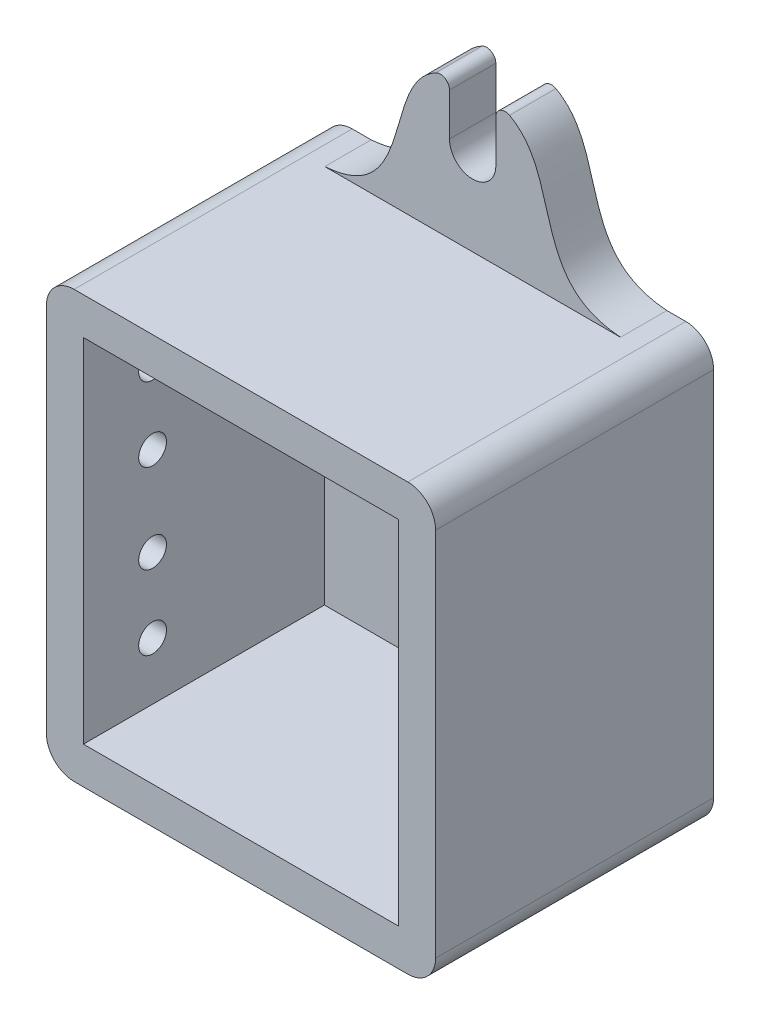
ISO-10303-21;
HEADER;
FILE_DESCRIPTION(('STEP AP214'),'2;1');
FILE_NAME('part.step','',(''),(''),'','','');
FILE_SCHEMA(('AUTOMOTIVE_DESIGN { 1 0 10303 214 1 1 1 1 }'));
ENDSEC;
DATA;
#1=APPLICATION_CONTEXT('core data for automotive mechanical design processes');
#2=APPLICATION_PROTOCOL_DEFINITION('international standard','automotive_design',2000,#1);
#3=PRODUCT_CONTEXT('',#1,'mechanical');
#4=PRODUCT('Part','Part','',(#3));
#5=PRODUCT_RELATED_PRODUCT_CATEGORY('part','',(#4));
#6=PRODUCT_DEFINITION_FORMATION('','',#4);
#7=PRODUCT_DEFINITION_CONTEXT('part definition',#1,'design');
#8=PRODUCT_DEFINITION('design','',#6,#7);
#9=PRODUCT_DEFINITION_SHAPE('','',#8);
#10=(LENGTH_UNIT() NAMED_UNIT(*) SI_UNIT(.MILLI.,.METRE.));
#11=(NAMED_UNIT(*) PLANE_ANGLE_UNIT() SI_UNIT($,.RADIAN.));
#12=(NAMED_UNIT(*) SI_UNIT($,.STERADIAN.) SOLID_ANGLE_UNIT());
#13=UNCERTAINTY_MEASURE_WITH_UNIT(LENGTH_MEASURE(1.E-05),#10,'distance_accuracy_value','');
#14=(GEOMETRIC_REPRESENTATION_CONTEXT(3) GLOBAL_UNCERTAINTY_ASSIGNED_CONTEXT((#13)) GLOBAL_UNIT_ASSIGNED_CONTEXT((#10,
#11,#12)) REPRESENTATION_CONTEXT('',''));
#15=CARTESIAN_POINT('',(0.,0.,0.));
#16=DIRECTION('',(0.,0.,1.));
#17=DIRECTION('',(1.,0.,0.));
#18=AXIS2_PLACEMENT_3D('',#15,#16,#17);
#19=CARTESIAN_POINT('',(17.,-23.,30.));
#20=DIRECTION('',(0.,1.,0.));
#21=DIRECTION('',(-1.,0.,0.));
#22=AXIS2_PLACEMENT_3D('',#19,#20,#21);
#23=PLANE('',#22);
#24=DIRECTION('',(0.,0.,-1.));
#25=VECTOR('',#24,1.);
#26=CARTESIAN_POINT('',(-15.9566479453434,-23.,5.));
#27=LINE('',#26,#25);
#28=CARTESIAN_POINT('',(-15.9566479453434,-23.,5.));
#29=VERTEX_POINT('',#28);
#30=CARTESIAN_POINT('',(-15.9566479453434,-23.,0.));
#31=VERTEX_POINT('',#30);
#32=EDGE_CURVE('E262',#29,#31,#27,.T.);
#33=ORIENTED_EDGE('',*,*,#32,.F.);
#34=DIRECTION('',(-1.,0.,0.));
#35=VECTOR('',#34,1.);
#36=CARTESIAN_POINT('',(-15.9566479453434,-23.,5.));
#37=LINE('',#36,#35);
#38=CARTESIAN_POINT('',(15.9566479453434,-23.,5.));
#39=VERTEX_POINT('',#38);
#40=EDGE_CURVE('E251',#39,#29,#37,.T.);
#41=ORIENTED_EDGE('',*,*,#40,.F.);
#42=DIRECTION('',(0.,0.,-1.));
#43=VECTOR('',#42,1.);
#44=CARTESIAN_POINT('',(15.9566479453434,-23.,5.));
#45=LINE('',#44,#43);
#46=CARTESIAN_POINT('',(15.9566479453434,-23.,0.));
#47=VERTEX_POINT('',#46);
#48=EDGE_CURVE('E258',#39,#47,#45,.T.);
#49=ORIENTED_EDGE('',*,*,#48,.T.);
#50=DIRECTION('',(1.,0.,0.));
#51=VECTOR('',#50,1.);
#52=CARTESIAN_POINT('',(17.,-23.,0.));
#53=LINE('',#52,#51);
#54=CARTESIAN_POINT('',(18.,-23.,0.));
#55=VERTEX_POINT('',#54);
#56=EDGE_CURVE('E401',#47,#55,#53,.T.);
#57=ORIENTED_EDGE('',*,*,#56,.T.);
#58=DIRECTION('',(0.,0.,-1.));
#59=VECTOR('',#58,1.);
#60=CARTESIAN_POINT('',(18.,-23.,30.));
#61=LINE('',#60,#59);
#62=CARTESIAN_POINT('',(18.,-23.,30.));
#63=VERTEX_POINT('',#62);
#64=EDGE_CURVE('E441',#55,#63,#61,.F.);
#65=ORIENTED_EDGE('',*,*,#64,.T.);
#66=DIRECTION('',(1.,0.,0.));
#67=VECTOR('',#66,1.);
#68=CARTESIAN_POINT('',(17.,-23.,30.));
#69=LINE('',#68,#67);
#70=CARTESIAN_POINT('',(-18.,-23.,30.));
#71=VERTEX_POINT('',#70);
#72=EDGE_CURVE('E472',#71,#63,#69,.T.);
#73=ORIENTED_EDGE('',*,*,#72,.F.);
#74=DIRECTION('',(0.,0.,-1.));
#75=VECTOR('',#74,1.);
#76=CARTESIAN_POINT('',(-18.,-23.,30.));
#77=LINE('',#76,#75);
#78=CARTESIAN_POINT('',(-18.,-23.,0.));
#79=VERTEX_POINT('',#78);
#80=EDGE_CURVE('E456',#71,#79,#77,.T.);
#81=ORIENTED_EDGE('',*,*,#80,.T.);
#82=EDGE_CURVE('E394',#79,#31,#53,.T.);
#83=ORIENTED_EDGE('',*,*,#82,.T.);
#84=EDGE_LOOP('',(#33,#41,#49,#57,#65,#73,#81,#83));
#85=FACE_BOUND('',#84,.T.);
#86=ADVANCED_FACE('F57',(#85),#23,.F.);
#87=CARTESIAN_POINT('',(17.,23.,30.));
#88=DIRECTION('',(0.,-1.,0.));
#89=DIRECTION('',(1.,0.,0.));
#90=AXIS2_PLACEMENT_3D('',#87,#88,#89);
#91=PLANE('',#90);
#92=DIRECTION('',(0.,0.,-1.));
#93=VECTOR('',#92,1.);
#94=CARTESIAN_POINT('',(15.9566479453434,23.,5.));
#95=LINE('',#94,#93);
#96=CARTESIAN_POINT('',(15.9566479453434,23.,5.));
#97=VERTEX_POINT('',#96);
#98=CARTESIAN_POINT('',(15.9566479453434,23.,0.));
#99=VERTEX_POINT('',#98);
#100=EDGE_CURVE('E372',#97,#99,#95,.T.);
#101=ORIENTED_EDGE('',*,*,#100,.F.);
#102=DIRECTION('',(1.,0.,0.));
#103=VECTOR('',#102,1.);
#104=CARTESIAN_POINT('',(-15.9566479453434,23.,5.));
#105=LINE('',#104,#103);
#106=CARTESIAN_POINT('',(-15.9566479453434,23.,5.));
#107=VERTEX_POINT('',#106);
#108=EDGE_CURVE('E330',#107,#97,#105,.T.);
#109=ORIENTED_EDGE('',*,*,#108,.F.);
#110=DIRECTION('',(0.,0.,-1.));
#111=VECTOR('',#110,1.);
#112=CARTESIAN_POINT('',(-15.9566479453434,23.,5.));
#113=LINE('',#112,#111);
#114=CARTESIAN_POINT('',(-15.9566479453434,23.,0.));
#115=VERTEX_POINT('',#114);
#116=EDGE_CURVE('E378',#107,#115,#113,.T.);
#117=ORIENTED_EDGE('',*,*,#116,.T.);
#118=DIRECTION('',(-1.,0.,0.));
#119=VECTOR('',#118,1.);
#120=CARTESIAN_POINT('',(17.,23.,0.));
#121=LINE('',#120,#119);
#122=CARTESIAN_POINT('',(-18.,23.,0.));
#123=VERTEX_POINT('',#122);
#124=EDGE_CURVE('E411',#115,#123,#121,.T.);
#125=ORIENTED_EDGE('',*,*,#124,.T.);
#126=DIRECTION('',(0.,0.,-1.));
#127=VECTOR('',#126,1.);
#128=CARTESIAN_POINT('',(-18.,23.,30.));
#129=LINE('',#128,#127);
#130=CARTESIAN_POINT('',(-18.,23.,30.));
#131=VERTEX_POINT('',#130);
#132=EDGE_CURVE('E68',#123,#131,#129,.F.);
#133=ORIENTED_EDGE('',*,*,#132,.T.);
#134=DIRECTION('',(-1.,0.,0.));
#135=VECTOR('',#134,1.);
#136=CARTESIAN_POINT('',(17.,23.,30.));
#137=LINE('',#136,#135);
#138=CARTESIAN_POINT('',(18.,23.,30.));
#139=VERTEX_POINT('',#138);
#140=EDGE_CURVE('E462',#139,#131,#137,.T.);
#141=ORIENTED_EDGE('',*,*,#140,.F.);
#142=DIRECTION('',(0.,0.,-1.));
#143=VECTOR('',#142,1.);
#144=CARTESIAN_POINT('',(18.,23.,30.));
#145=LINE('',#144,#143);
#146=CARTESIAN_POINT('',(18.,23.,0.));
#147=VERTEX_POINT('',#146);
#148=EDGE_CURVE('E436',#139,#147,#145,.T.);
#149=ORIENTED_EDGE('',*,*,#148,.T.);
#150=EDGE_CURVE('E419',#147,#99,#121,.T.);
#151=ORIENTED_EDGE('',*,*,#150,.T.);
#152=EDGE_LOOP('',(#101,#109,#117,#125,#133,#141,#149,#151));
#153=FACE_BOUND('',#152,.T.);
#154=ADVANCED_FACE('F547',(#153),#91,.F.);
#155=CARTESIAN_POINT('',(-17.,-19.,30.));
#156=DIRECTION('',(1.,0.,0.));
#157=DIRECTION('',(0.,0.,-1.));
#158=AXIS2_PLACEMENT_3D('',#155,#156,#157);
#159=PLANE('',#158);
#160=CARTESIAN_POINT('',(-17.,-12.7949495908526,22.5407271451275));
#161=DIRECTION('',(-1.,0.,0.));
#162=DIRECTION('',(0.,0.,-1.));
#163=AXIS2_PLACEMENT_3D('',#160,#161,#162);
#164=CIRCLE('',#163,1.5);
#165=CARTESIAN_POINT('',(-17.,-12.7949495908526,21.0407271451275));
#166=VERTEX_POINT('',#165);
#167=EDGE_CURVE('E375',#166,#166,#164,.T.);
#168=ORIENTED_EDGE('',*,*,#167,.T.);
#169=EDGE_LOOP('',(#168));
#170=FACE_BOUND('',#169,.T.);
#171=CARTESIAN_POINT('',(-17.,-4.79494959085259,22.5407271451275));
#172=DIRECTION('',(-1.,0.,0.));
#173=DIRECTION('',(0.,0.,-1.));
#174=AXIS2_PLACEMENT_3D('',#171,#172,#173);
#175=CIRCLE('',#174,1.5);
#176=CARTESIAN_POINT('',(-17.,-4.79494959085259,21.0407271451275));
#177=VERTEX_POINT('',#176);
#178=EDGE_CURVE('E516',#177,#177,#175,.T.);
#179=ORIENTED_EDGE('',*,*,#178,.T.);
#180=EDGE_LOOP('',(#179));
#181=FACE_BOUND('',#180,.T.);
#182=CARTESIAN_POINT('',(-17.,4.79494959085258,22.5407271451275));
#183=DIRECTION('',(-1.,0.,0.));
#184=DIRECTION('',(0.,0.,1.));
#185=AXIS2_PLACEMENT_3D('',#182,#183,#184);
#186=CIRCLE('',#185,1.5);
#187=CARTESIAN_POINT('',(-17.,4.79494959085258,24.0407271451275));
#188=VERTEX_POINT('',#187);
#189=EDGE_CURVE('E510',#188,#188,#186,.T.);
#190=ORIENTED_EDGE('',*,*,#189,.T.);
#191=EDGE_LOOP('',(#190));
#192=FACE_BOUND('',#191,.T.);
#193=CARTESIAN_POINT('',(-17.,12.7949495908526,22.5407271451275));
#194=DIRECTION('',(-1.,0.,0.));
#195=DIRECTION('',(0.,0.,1.));
#196=AXIS2_PLACEMENT_3D('',#193,#194,#195);
#197=CIRCLE('',#196,1.5);
#198=CARTESIAN_POINT('',(-17.,12.7949495908526,24.0407271451275));
#199=VERTEX_POINT('',#198);
#200=EDGE_CURVE('E506',#199,#199,#197,.T.);
#201=ORIENTED_EDGE('',*,*,#200,.T.);
#202=EDGE_LOOP('',(#201));
#203=FACE_BOUND('',#202,.T.);
#204=DIRECTION('',(0.,0.,-1.));
#205=VECTOR('',#204,1.);
#206=CARTESIAN_POINT('',(-17.,-19.,30.));
#207=LINE('',#206,#205);
#208=CARTESIAN_POINT('',(-17.,-19.,30.));
#209=VERTEX_POINT('',#208);
#210=CARTESIAN_POINT('',(-17.,-19.,4.));
#211=VERTEX_POINT('',#210);
#212=EDGE_CURVE('E478',#209,#211,#207,.T.);
#213=ORIENTED_EDGE('',*,*,#212,.T.);
#214=DIRECTION('',(0.,1.,0.));
#215=VECTOR('',#214,1.);
#216=CARTESIAN_POINT('',(-17.,-19.,4.));
#217=LINE('',#216,#215);
#218=CARTESIAN_POINT('',(-17.,19.,4.));
#219=VERTEX_POINT('',#218);
#220=EDGE_CURVE('E497',#211,#219,#217,.T.);
#221=ORIENTED_EDGE('',*,*,#220,.T.);
#222=DIRECTION('',(0.,0.,-1.));
#223=VECTOR('',#222,1.);
#224=CARTESIAN_POINT('',(-17.,19.,30.));
#225=LINE('',#224,#223);
#226=CARTESIAN_POINT('',(-17.,19.,30.));
#227=VERTEX_POINT('',#226);
#228=EDGE_CURVE('E486',#227,#219,#225,.T.);
#229=ORIENTED_EDGE('',*,*,#228,.F.);
#230=DIRECTION('',(0.,-1.,0.));
#231=VECTOR('',#230,1.);
#232=CARTESIAN_POINT('',(-17.,-19.,30.));
#233=LINE('',#232,#231);
#234=EDGE_CURVE('E495',#227,#209,#233,.T.);
#235=ORIENTED_EDGE('',*,*,#234,.T.);
#236=EDGE_LOOP('',(#213,#221,#229,#235));
#237=FACE_BOUND('',#236,.T.);
#238=ADVANCED_FACE('F529',(#170,#181,#192,#203,#237),#159,.T.);
#239=CARTESIAN_POINT('',(17.,-19.,30.));
#240=DIRECTION('',(0.,1.,0.));
#241=DIRECTION('',(-1.,0.,0.));
#242=AXIS2_PLACEMENT_3D('',#239,#240,#241);
#243=PLANE('',#242);
#244=DIRECTION('',(0.,0.,-1.));
#245=VECTOR('',#244,1.);
#246=CARTESIAN_POINT('',(17.,-19.,30.));
#247=LINE('',#246,#245);
#248=CARTESIAN_POINT('',(17.,-19.,30.));
#249=VERTEX_POINT('',#248);
#250=CARTESIAN_POINT('',(17.,-19.,4.));
#251=VERTEX_POINT('',#250);
#252=EDGE_CURVE('E481',#249,#251,#247,.T.);
#253=ORIENTED_EDGE('',*,*,#252,.T.);
#254=DIRECTION('',(-1.,0.,0.));
#255=VECTOR('',#254,1.);
#256=CARTESIAN_POINT('',(17.,-19.,4.));
#257=LINE('',#256,#255);
#258=EDGE_CURVE('E500',#251,#211,#257,.T.);
#259=ORIENTED_EDGE('',*,*,#258,.T.);
#260=ORIENTED_EDGE('',*,*,#212,.F.);
#261=DIRECTION('',(1.,0.,0.));
#262=VECTOR('',#261,1.);
#263=CARTESIAN_POINT('',(17.,-19.,30.));
#264=LINE('',#263,#262);
#265=EDGE_CURVE('E493',#209,#249,#264,.T.);
#266=ORIENTED_EDGE('',*,*,#265,.T.);
#267=EDGE_LOOP('',(#253,#259,#260,#266));
#268=FACE_BOUND('',#267,.T.);
#269=ADVANCED_FACE('F851',(#268),#243,.T.);
#270=CARTESIAN_POINT('',(17.,-19.,30.));
#271=DIRECTION('',(-1.,0.,0.));
#272=DIRECTION('',(0.,0.,1.));
#273=AXIS2_PLACEMENT_3D('',#270,#271,#272);
#274=PLANE('',#273);
#275=DIRECTION('',(0.,0.,-1.));
#276=VECTOR('',#275,1.);
#277=CARTESIAN_POINT('',(17.,19.,30.));
#278=LINE('',#277,#276);
#279=CARTESIAN_POINT('',(17.,19.,30.));
#280=VERTEX_POINT('',#279);
#281=CARTESIAN_POINT('',(17.,19.,4.));
#282=VERTEX_POINT('',#281);
#283=EDGE_CURVE('E484',#280,#282,#278,.T.);
#284=ORIENTED_EDGE('',*,*,#283,.T.);
#285=DIRECTION('',(0.,-1.,0.));
#286=VECTOR('',#285,1.);
#287=CARTESIAN_POINT('',(17.,-19.,4.));
#288=LINE('',#287,#286);
#289=EDGE_CURVE('E503',#282,#251,#288,.T.);
#290=ORIENTED_EDGE('',*,*,#289,.T.);
#291=ORIENTED_EDGE('',*,*,#252,.F.);
#292=DIRECTION('',(0.,1.,0.));
#293=VECTOR('',#292,1.);
#294=CARTESIAN_POINT('',(17.,-19.,30.));
#295=LINE('',#294,#293);
#296=EDGE_CURVE('E490',#249,#280,#295,.T.);
#297=ORIENTED_EDGE('',*,*,#296,.T.);
#298=EDGE_LOOP('',(#284,#290,#291,#297));
#299=FACE_BOUND('',#298,.T.);
#300=ADVANCED_FACE('F843',(#299),#274,.T.);
#301=CARTESIAN_POINT('',(17.,19.,30.));
#302=DIRECTION('',(0.,-1.,0.));
#303=DIRECTION('',(1.,0.,0.));
#304=AXIS2_PLACEMENT_3D('',#301,#302,#303);
#305=PLANE('',#304);
#306=ORIENTED_EDGE('',*,*,#228,.T.);
#307=DIRECTION('',(1.,0.,0.));
#308=VECTOR('',#307,1.);
#309=CARTESIAN_POINT('',(17.,19.,4.));
#310=LINE('',#309,#308);
#311=EDGE_CURVE('E414',#219,#282,#310,.T.);
#312=ORIENTED_EDGE('',*,*,#311,.T.);
#313=ORIENTED_EDGE('',*,*,#283,.F.);
#314=DIRECTION('',(-1.,0.,0.));
#315=VECTOR('',#314,1.);
#316=CARTESIAN_POINT('',(17.,19.,30.));
#317=LINE('',#316,#315);
#318=EDGE_CURVE('E488',#280,#227,#317,.T.);
#319=ORIENTED_EDGE('',*,*,#318,.T.);
#320=EDGE_LOOP('',(#306,#312,#313,#319));
#321=FACE_BOUND('',#320,.T.);
#322=ADVANCED_FACE('F824',(#321),#305,.T.);
#323=CARTESIAN_POINT('',(0.,0.,30.));
#324=DIRECTION('',(0.,0.,1.));
#325=DIRECTION('',(1.,0.,0.));
#326=AXIS2_PLACEMENT_3D('',#323,#324,#325);
#327=PLANE('',#326);
#328=ORIENTED_EDGE('',*,*,#140,.T.);
#329=CARTESIAN_POINT('',(-18.,20.,30.));
#330=DIRECTION('',(0.,0.,1.));
#331=DIRECTION('',(1.,0.,0.));
#332=AXIS2_PLACEMENT_3D('',#329,#330,#331);
#333=CIRCLE('',#332,3.);
#334=CARTESIAN_POINT('',(-21.,20.,30.));
#335=VERTEX_POINT('',#334);
#336=EDGE_CURVE('E12',#131,#335,#333,.T.);
#337=ORIENTED_EDGE('',*,*,#336,.T.);
#338=DIRECTION('',(0.,-1.,0.));
#339=VECTOR('',#338,1.);
#340=CARTESIAN_POINT('',(-21.,-19.,30.));
#341=LINE('',#340,#339);
#342=CARTESIAN_POINT('',(-21.,-20.,30.));
#343=VERTEX_POINT('',#342);
#344=EDGE_CURVE('E421',#335,#343,#341,.T.);
#345=ORIENTED_EDGE('',*,*,#344,.T.);
#346=CARTESIAN_POINT('',(-18.,-20.,30.));
#347=DIRECTION('',(0.,0.,1.));
#348=DIRECTION('',(1.,0.,0.));
#349=AXIS2_PLACEMENT_3D('',#346,#347,#348);
#350=CIRCLE('',#349,3.);
#351=EDGE_CURVE('E449',#343,#71,#350,.T.);
#352=ORIENTED_EDGE('',*,*,#351,.T.);
#353=ORIENTED_EDGE('',*,*,#72,.T.);
#354=CARTESIAN_POINT('',(18.,-20.,30.));
#355=DIRECTION('',(0.,0.,1.));
#356=DIRECTION('',(1.,0.,0.));
#357=AXIS2_PLACEMENT_3D('',#354,#355,#356);
#358=CIRCLE('',#357,3.);
#359=CARTESIAN_POINT('',(21.,-20.,30.));
#360=VERTEX_POINT('',#359);
#361=EDGE_CURVE('E439',#63,#360,#358,.T.);
#362=ORIENTED_EDGE('',*,*,#361,.T.);
#363=DIRECTION('',(0.,1.,0.));
#364=VECTOR('',#363,1.);
#365=CARTESIAN_POINT('',(21.,-19.,30.));
#366=LINE('',#365,#364);
#367=CARTESIAN_POINT('',(21.,20.,30.));
#368=VERTEX_POINT('',#367);
#369=EDGE_CURVE('E467',#360,#368,#366,.T.);
#370=ORIENTED_EDGE('',*,*,#369,.T.);
#371=CARTESIAN_POINT('',(18.,20.,30.));
#372=DIRECTION('',(0.,0.,1.));
#373=DIRECTION('',(1.,0.,0.));
#374=AXIS2_PLACEMENT_3D('',#371,#372,#373);
#375=CIRCLE('',#374,3.);
#376=EDGE_CURVE('E430',#368,#139,#375,.T.);
#377=ORIENTED_EDGE('',*,*,#376,.T.);
#378=EDGE_LOOP('',(#328,#337,#345,#352,#353,#362,#370,#377));
#379=FACE_BOUND('',#378,.T.);
#380=ORIENTED_EDGE('',*,*,#265,.F.);
#381=ORIENTED_EDGE('',*,*,#234,.F.);
#382=ORIENTED_EDGE('',*,*,#318,.F.);
#383=ORIENTED_EDGE('',*,*,#296,.F.);
#384=EDGE_LOOP('',(#380,#381,#382,#383));
#385=FACE_BOUND('',#384,.T.);
#386=ADVANCED_FACE('F574',(#379,#385),#327,.T.);
#387=CARTESIAN_POINT('',(0.,0.,0.));
#388=DIRECTION('',(0.,0.,1.));
#389=DIRECTION('',(1.,0.,0.));
#390=AXIS2_PLACEMENT_3D('',#387,#388,#389);
#391=PLANE('',#390);
#392=DIRECTION('',(0.,-1.,0.));
#393=VECTOR('',#392,1.);
#394=CARTESIAN_POINT('',(-21.,-19.,0.));
#395=LINE('',#394,#393);
#396=CARTESIAN_POINT('',(-21.,20.,0.));
#397=VERTEX_POINT('',#396);
#398=CARTESIAN_POINT('',(-21.,-20.,0.));
#399=VERTEX_POINT('',#398);
#400=EDGE_CURVE('E406',#397,#399,#395,.T.);
#401=ORIENTED_EDGE('',*,*,#400,.F.);
#402=CARTESIAN_POINT('',(-18.,20.,0.));
#403=DIRECTION('',(0.,0.,1.));
#404=DIRECTION('',(1.,0.,0.));
#405=AXIS2_PLACEMENT_3D('',#402,#403,#404);
#406=CIRCLE('',#405,3.);
#407=EDGE_CURVE('E424',#397,#123,#406,.F.);
#408=ORIENTED_EDGE('',*,*,#407,.T.);
#409=ORIENTED_EDGE('',*,*,#124,.F.);
#410=CARTESIAN_POINT('',(-3.97906246858665,37.7543608643955,0.));
#411=CARTESIAN_POINT('',(-5.18382703441698,37.0968419483948,0.));
#412=CARTESIAN_POINT('',(-9.02198880723127,32.3292350393377,0.));
#413=CARTESIAN_POINT('',(-8.11409981241254,23.5657849330971,0.));
#414=CARTESIAN_POINT('',(-15.9566479453434,23.,0.));
#415=B_SPLINE_CURVE_WITH_KNOTS('',3,(#410,#411,#412,#413,#414),.UNSPECIFIED.,.F.,.F.,(4,1,4),
(0.,0.176691298398676,0.852915934482998),.UNSPECIFIED.);
#416=CARTESIAN_POINT('',(-3.97906246858665,37.7543608643955,0.));
#417=VERTEX_POINT('',#416);
#418=EDGE_CURVE('E84',#417,#115,#415,.T.);
#419=ORIENTED_EDGE('',*,*,#418,.F.);
#420=CARTESIAN_POINT('',(-3.5,36.876580053947,0.));
#421=DIRECTION('',(0.,0.,1.));
#422=DIRECTION('',(-1.,0.,0.));
#423=AXIS2_PLACEMENT_3D('',#420,#421,#422);
#424=CIRCLE('',#423,0.999999999999994);
#425=CARTESIAN_POINT('',(-2.5,36.876580053947,0.));
#426=VERTEX_POINT('',#425);
#427=EDGE_CURVE('E353',#426,#417,#424,.T.);
#428=ORIENTED_EDGE('',*,*,#427,.F.);
#429=DIRECTION('',(0.,1.,0.));
#430=VECTOR('',#429,1.);
#431=CARTESIAN_POINT('',(-2.5,32.2997890935142,0.));
#432=LINE('',#431,#430);
#433=CARTESIAN_POINT('',(-2.49999999999999,32.2997890935142,0.));
#434=VERTEX_POINT('',#433);
#435=EDGE_CURVE('E351',#434,#426,#432,.T.);
#436=ORIENTED_EDGE('',*,*,#435,.F.);
#437=CARTESIAN_POINT('',(0.,32.2997890935142,0.));
#438=DIRECTION('',(0.,0.,-1.));
#439=DIRECTION('',(1.,0.,0.));
#440=AXIS2_PLACEMENT_3D('',#437,#438,#439);
#441=CIRCLE('',#440,2.5);
#442=CARTESIAN_POINT('',(2.5,32.2997890935142,0.));
#443=VERTEX_POINT('',#442);
#444=EDGE_CURVE('E349',#443,#434,#441,.T.);
#445=ORIENTED_EDGE('',*,*,#444,.F.);
#446=DIRECTION('',(0.,-1.,0.));
#447=VECTOR('',#446,1.);
#448=CARTESIAN_POINT('',(2.5,32.2997890935142,0.));
#449=LINE('',#448,#447);
#450=CARTESIAN_POINT('',(2.49999999999999,36.876580053947,0.));
#451=VERTEX_POINT('',#450);
#452=EDGE_CURVE('E346',#451,#443,#449,.T.);
#453=ORIENTED_EDGE('',*,*,#452,.F.);
#454=CARTESIAN_POINT('',(3.5,36.876580053947,0.));
#455=DIRECTION('',(0.,0.,1.));
#456=DIRECTION('',(1.,0.,0.));
#457=AXIS2_PLACEMENT_3D('',#454,#455,#456);
#458=CIRCLE('',#457,1.00000000000001);
#459=CARTESIAN_POINT('',(3.97906246858665,37.7543608643956,0.));
#460=VERTEX_POINT('',#459);
#461=EDGE_CURVE('E344',#460,#451,#458,.T.);
#462=ORIENTED_EDGE('',*,*,#461,.F.);
#463=CARTESIAN_POINT('',(15.9566479453434,23.,0.));
#464=CARTESIAN_POINT('',(8.11409981241254,23.5657849330971,0.));
#465=CARTESIAN_POINT('',(9.0219888072313,32.3292350393377,0.));
#466=CARTESIAN_POINT('',(5.18382703441697,37.0968419483948,0.));
#467=CARTESIAN_POINT('',(3.97906246858665,37.7543608643956,0.));
#468=B_SPLINE_CURVE_WITH_KNOTS('',3,(#463,#464,#465,#466,#467),.UNSPECIFIED.,.F.,.F.,(4,1,4),
(0.,0.676224636084321,0.852915934482999),.UNSPECIFIED.);
#469=EDGE_CURVE('E347',#99,#460,#468,.T.);
#470=ORIENTED_EDGE('',*,*,#469,.F.);
#471=ORIENTED_EDGE('',*,*,#150,.F.);
#472=CARTESIAN_POINT('',(18.,20.,0.));
#473=DIRECTION('',(0.,0.,1.));
#474=DIRECTION('',(1.,0.,0.));
#475=AXIS2_PLACEMENT_3D('',#472,#473,#474);
#476=CIRCLE('',#475,3.);
#477=CARTESIAN_POINT('',(21.,20.,0.));
#478=VERTEX_POINT('',#477);
#479=EDGE_CURVE('E434',#147,#478,#476,.F.);
#480=ORIENTED_EDGE('',*,*,#479,.T.);
#481=DIRECTION('',(0.,1.,0.));
#482=VECTOR('',#481,1.);
#483=CARTESIAN_POINT('',(21.,-19.,0.));
#484=LINE('',#483,#482);
#485=CARTESIAN_POINT('',(21.,-20.,0.));
#486=VERTEX_POINT('',#485);
#487=EDGE_CURVE('E400',#486,#478,#484,.T.);
#488=ORIENTED_EDGE('',*,*,#487,.F.);
#489=CARTESIAN_POINT('',(18.,-20.,0.));
#490=DIRECTION('',(0.,0.,1.));
#491=DIRECTION('',(1.,0.,0.));
#492=AXIS2_PLACEMENT_3D('',#489,#490,#491);
#493=CIRCLE('',#492,3.);
#494=EDGE_CURVE('E443',#486,#55,#493,.F.);
#495=ORIENTED_EDGE('',*,*,#494,.T.);
#496=ORIENTED_EDGE('',*,*,#56,.F.);
#497=CARTESIAN_POINT('',(3.97906246858666,-37.7543608643956,0.));
#498=CARTESIAN_POINT('',(5.18382703441698,-37.0968419483948,0.));
#499=CARTESIAN_POINT('',(9.02198880723131,-32.3292350393377,0.));
#500=CARTESIAN_POINT('',(8.11409981241254,-23.5657849330971,0.));
#501=CARTESIAN_POINT('',(15.9566479453435,-23.,0.));
#502=B_SPLINE_CURVE_WITH_KNOTS('',3,(#497,#498,#499,#500,#501),.UNSPECIFIED.,.F.,.F.,(4,1,4),
(0.,0.176691298398678,0.852915934482999),.UNSPECIFIED.);
#503=CARTESIAN_POINT('',(3.97906246858664,-37.7543608643956,0.));
#504=VERTEX_POINT('',#503);
#505=EDGE_CURVE('E76',#504,#47,#502,.T.);
#506=ORIENTED_EDGE('',*,*,#505,.F.);
#507=CARTESIAN_POINT('',(3.5,-36.876580053947,0.));
#508=DIRECTION('',(0.,0.,1.));
#509=DIRECTION('',(-1.,0.,0.));
#510=AXIS2_PLACEMENT_3D('',#507,#508,#509);
#511=CIRCLE('',#510,1.00000000000001);
#512=CARTESIAN_POINT('',(2.5,-36.876580053947,0.));
#513=VERTEX_POINT('',#512);
#514=EDGE_CURVE('E256',#513,#504,#511,.T.);
#515=ORIENTED_EDGE('',*,*,#514,.F.);
#516=DIRECTION('',(0.,-1.,0.));
#517=VECTOR('',#516,1.);
#518=CARTESIAN_POINT('',(2.5,-32.2997890935142,0.));
#519=LINE('',#518,#517);
#520=CARTESIAN_POINT('',(2.50000000000001,-32.2997890935142,0.));
#521=VERTEX_POINT('',#520);
#522=EDGE_CURVE('E636',#521,#513,#519,.T.);
#523=ORIENTED_EDGE('',*,*,#522,.F.);
#524=CARTESIAN_POINT('',(0.,-32.2997890935142,0.));
#525=DIRECTION('',(0.,0.,-1.));
#526=DIRECTION('',(-1.,0.,0.));
#527=AXIS2_PLACEMENT_3D('',#524,#525,#526);
#528=CIRCLE('',#527,2.5);
#529=CARTESIAN_POINT('',(-2.5,-32.2997890935142,0.));
#530=VERTEX_POINT('',#529);
#531=EDGE_CURVE('E630',#530,#521,#528,.T.);
#532=ORIENTED_EDGE('',*,*,#531,.F.);
#533=DIRECTION('',(0.,1.,0.));
#534=VECTOR('',#533,1.);
#535=CARTESIAN_POINT('',(-2.5,-32.2997890935142,0.));
#536=LINE('',#535,#534);
#537=CARTESIAN_POINT('',(-2.5,-36.876580053947,0.));
#538=VERTEX_POINT('',#537);
#539=EDGE_CURVE('E624',#538,#530,#536,.T.);
#540=ORIENTED_EDGE('',*,*,#539,.F.);
#541=CARTESIAN_POINT('',(-3.5,-36.876580053947,0.));
#542=DIRECTION('',(0.,0.,1.));
#543=DIRECTION('',(1.,0.,0.));
#544=AXIS2_PLACEMENT_3D('',#541,#542,#543);
#545=CIRCLE('',#544,0.999999999999994);
#546=CARTESIAN_POINT('',(-3.97906246858664,-37.7543608643955,0.));
#547=VERTEX_POINT('',#546);
#548=EDGE_CURVE('E620',#547,#538,#545,.T.);
#549=ORIENTED_EDGE('',*,*,#548,.F.);
#550=CARTESIAN_POINT('',(-15.9566479453434,-23.,0.));
#551=CARTESIAN_POINT('',(-8.11409981241253,-23.5657849330971,0.));
#552=CARTESIAN_POINT('',(-9.02198880723126,-32.3292350393377,0.));
#553=CARTESIAN_POINT('',(-5.18382703441697,-37.0968419483948,0.));
#554=CARTESIAN_POINT('',(-3.97906246858664,-37.7543608643955,0.));
#555=B_SPLINE_CURVE_WITH_KNOTS('',3,(#550,#551,#552,#553,#554),.UNSPECIFIED.,.F.,.F.,(4,1,4),
(0.,0.676224636084321,0.852915934482998),.UNSPECIFIED.);
#556=EDGE_CURVE('E619',#31,#547,#555,.T.);
#557=ORIENTED_EDGE('',*,*,#556,.F.);
#558=ORIENTED_EDGE('',*,*,#82,.F.);
#559=CARTESIAN_POINT('',(-18.,-20.,0.));
#560=DIRECTION('',(0.,0.,1.));
#561=DIRECTION('',(1.,0.,0.));
#562=AXIS2_PLACEMENT_3D('',#559,#560,#561);
#563=CIRCLE('',#562,3.);
#564=EDGE_CURVE('E454',#79,#399,#563,.F.);
#565=ORIENTED_EDGE('',*,*,#564,.T.);
#566=EDGE_LOOP('',(#401,#408,#409,#419,#428,#436,#445,#453,#462,#470,#471,#480,#488,#495,#496,
#506,#515,#523,#532,#540,#549,#557,#558,#565));
#567=FACE_BOUND('',#566,.T.);
#568=ADVANCED_FACE('F559',(#567),#391,.F.);
#569=CARTESIAN_POINT('',(-21.,-19.,30.));
#570=DIRECTION('',(1.,0.,0.));
#571=DIRECTION('',(0.,0.,-1.));
#572=AXIS2_PLACEMENT_3D('',#569,#570,#571);
#573=PLANE('',#572);
#574=CARTESIAN_POINT('',(-21.,-12.7949495908526,22.5407271451275));
#575=DIRECTION('',(-1.,0.,0.));
#576=DIRECTION('',(0.,0.,-1.));
#577=AXIS2_PLACEMENT_3D('',#574,#575,#576);
#578=CIRCLE('',#577,1.5);
#579=CARTESIAN_POINT('',(-21.,-12.7949495908526,21.0407271451275));
#580=VERTEX_POINT('',#579);
#581=EDGE_CURVE('E381',#580,#580,#578,.T.);
#582=ORIENTED_EDGE('',*,*,#581,.F.);
#583=EDGE_LOOP('',(#582));
#584=FACE_BOUND('',#583,.T.);
#585=CARTESIAN_POINT('',(-21.,-4.79494959085259,22.5407271451275));
#586=DIRECTION('',(-1.,0.,0.));
#587=DIRECTION('',(0.,0.,-1.));
#588=AXIS2_PLACEMENT_3D('',#585,#586,#587);
#589=CIRCLE('',#588,1.5);
#590=CARTESIAN_POINT('',(-21.,-4.79494959085259,21.0407271451275));
#591=VERTEX_POINT('',#590);
#592=EDGE_CURVE('E519',#591,#591,#589,.T.);
#593=ORIENTED_EDGE('',*,*,#592,.F.);
#594=EDGE_LOOP('',(#593));
#595=FACE_BOUND('',#594,.T.);
#596=CARTESIAN_POINT('',(-21.,4.79494959085258,22.5407271451275));
#597=DIRECTION('',(-1.,0.,0.));
#598=DIRECTION('',(0.,0.,1.));
#599=AXIS2_PLACEMENT_3D('',#596,#597,#598);
#600=CIRCLE('',#599,1.5);
#601=CARTESIAN_POINT('',(-21.,4.79494959085258,24.0407271451275));
#602=VERTEX_POINT('',#601);
#603=EDGE_CURVE('E513',#602,#602,#600,.T.);
#604=ORIENTED_EDGE('',*,*,#603,.F.);
#605=EDGE_LOOP('',(#604));
#606=FACE_BOUND('',#605,.T.);
#607=CARTESIAN_POINT('',(-21.,12.7949495908526,22.5407271451275));
#608=DIRECTION('',(-1.,0.,0.));
#609=DIRECTION('',(0.,0.,1.));
#610=AXIS2_PLACEMENT_3D('',#607,#608,#609);
#611=CIRCLE('',#610,1.5);
#612=CARTESIAN_POINT('',(-21.,12.7949495908526,24.0407271451275));
#613=VERTEX_POINT('',#612);
#614=EDGE_CURVE('E507',#613,#613,#611,.T.);
#615=ORIENTED_EDGE('',*,*,#614,.F.);
#616=EDGE_LOOP('',(#615));
#617=FACE_BOUND('',#616,.T.);
#618=ORIENTED_EDGE('',*,*,#344,.F.);
#619=DIRECTION('',(0.,0.,-1.));
#620=VECTOR('',#619,1.);
#621=CARTESIAN_POINT('',(-21.,20.,30.));
#622=LINE('',#621,#620);
#623=EDGE_CURVE('E427',#335,#397,#622,.T.);
#624=ORIENTED_EDGE('',*,*,#623,.T.);
#625=ORIENTED_EDGE('',*,*,#400,.T.);
#626=DIRECTION('',(0.,0.,-1.));
#627=VECTOR('',#626,1.);
#628=CARTESIAN_POINT('',(-21.,-20.,30.));
#629=LINE('',#628,#627);
#630=EDGE_CURVE('E451',#399,#343,#629,.F.);
#631=ORIENTED_EDGE('',*,*,#630,.T.);
#632=EDGE_LOOP('',(#618,#624,#625,#631));
#633=FACE_BOUND('',#632,.T.);
#634=ADVANCED_FACE('F557',(#584,#595,#606,#617,#633),#573,.F.);
#635=CARTESIAN_POINT('',(21.,-19.,30.));
#636=DIRECTION('',(-1.,0.,0.));
#637=DIRECTION('',(0.,0.,1.));
#638=AXIS2_PLACEMENT_3D('',#635,#636,#637);
#639=PLANE('',#638);
#640=ORIENTED_EDGE('',*,*,#487,.T.);
#641=DIRECTION('',(0.,0.,-1.));
#642=VECTOR('',#641,1.);
#643=CARTESIAN_POINT('',(21.,20.,30.));
#644=LINE('',#643,#642);
#645=EDGE_CURVE('E432',#478,#368,#644,.F.);
#646=ORIENTED_EDGE('',*,*,#645,.T.);
#647=ORIENTED_EDGE('',*,*,#369,.F.);
#648=DIRECTION('',(0.,0.,-1.));
#649=VECTOR('',#648,1.);
#650=CARTESIAN_POINT('',(21.,-20.,30.));
#651=LINE('',#650,#649);
#652=EDGE_CURVE('E446',#360,#486,#651,.T.);
#653=ORIENTED_EDGE('',*,*,#652,.T.);
#654=EDGE_LOOP('',(#640,#646,#647,#653));
#655=FACE_BOUND('',#654,.T.);
#656=ADVANCED_FACE('F556',(#655),#639,.F.);
#657=CARTESIAN_POINT('',(0.,0.,4.));
#658=DIRECTION('',(0.,0.,-1.));
#659=DIRECTION('',(-1.,0.,0.));
#660=AXIS2_PLACEMENT_3D('',#657,#658,#659);
#661=PLANE('',#660);
#662=ORIENTED_EDGE('',*,*,#220,.F.);
#663=ORIENTED_EDGE('',*,*,#258,.F.);
#664=ORIENTED_EDGE('',*,*,#289,.F.);
#665=ORIENTED_EDGE('',*,*,#311,.F.);
#666=EDGE_LOOP('',(#662,#663,#664,#665));
#667=FACE_BOUND('',#666,.T.);
#668=ADVANCED_FACE('F771',(#667),#661,.F.);
#669=CARTESIAN_POINT('',(-17.,12.7949495908526,22.5407271451275));
#670=DIRECTION('',(-1.,0.,0.));
#671=DIRECTION('',(0.,0.,1.));
#672=AXIS2_PLACEMENT_3D('',#669,#670,#671);
#673=CYLINDRICAL_SURFACE('',#672,1.5);
#674=ORIENTED_EDGE('',*,*,#200,.F.);
#675=EDGE_LOOP('',(#674));
#676=FACE_BOUND('',#675,.T.);
#677=ORIENTED_EDGE('',*,*,#614,.T.);
#678=EDGE_LOOP('',(#677));
#679=FACE_BOUND('',#678,.T.);
#680=ADVANCED_FACE('F778',(#676,#679),#673,.F.);
#681=CARTESIAN_POINT('',(-17.,4.79494959085258,22.5407271451275));
#682=DIRECTION('',(-1.,0.,0.));
#683=DIRECTION('',(0.,0.,1.));
#684=AXIS2_PLACEMENT_3D('',#681,#682,#683);
#685=CYLINDRICAL_SURFACE('',#684,1.5);
#686=ORIENTED_EDGE('',*,*,#189,.F.);
#687=EDGE_LOOP('',(#686));
#688=FACE_BOUND('',#687,.T.);
#689=ORIENTED_EDGE('',*,*,#603,.T.);
#690=EDGE_LOOP('',(#689));
#691=FACE_BOUND('',#690,.T.);
#692=ADVANCED_FACE('F543',(#688,#691),#685,.F.);
#693=CARTESIAN_POINT('',(-17.,-4.79494959085259,22.5407271451275));
#694=DIRECTION('',(-1.,0.,0.));
#695=DIRECTION('',(0.,0.,1.));
#696=AXIS2_PLACEMENT_3D('',#693,#694,#695);
#697=CYLINDRICAL_SURFACE('',#696,1.5);
#698=ORIENTED_EDGE('',*,*,#178,.F.);
#699=EDGE_LOOP('',(#698));
#700=FACE_BOUND('',#699,.T.);
#701=ORIENTED_EDGE('',*,*,#592,.T.);
#702=EDGE_LOOP('',(#701));
#703=FACE_BOUND('',#702,.T.);
#704=ADVANCED_FACE('F535',(#700,#703),#697,.F.);
#705=CARTESIAN_POINT('',(-17.,-12.7949495908526,22.5407271451275));
#706=DIRECTION('',(-1.,0.,0.));
#707=DIRECTION('',(0.,0.,1.));
#708=AXIS2_PLACEMENT_3D('',#705,#706,#707);
#709=CYLINDRICAL_SURFACE('',#708,1.5);
#710=ORIENTED_EDGE('',*,*,#167,.F.);
#711=EDGE_LOOP('',(#710));
#712=FACE_BOUND('',#711,.T.);
#713=ORIENTED_EDGE('',*,*,#581,.T.);
#714=EDGE_LOOP('',(#713));
#715=FACE_BOUND('',#714,.T.);
#716=ADVANCED_FACE('F532',(#712,#715),#709,.F.);
#717=CARTESIAN_POINT('',(-18.,-20.,30.));
#718=DIRECTION('',(0.,0.,-1.));
#719=DIRECTION('',(-1.,0.,0.));
#720=AXIS2_PLACEMENT_3D('',#717,#718,#719);
#721=CYLINDRICAL_SURFACE('',#720,3.);
#722=ORIENTED_EDGE('',*,*,#351,.F.);
#723=ORIENTED_EDGE('',*,*,#630,.F.);
#724=ORIENTED_EDGE('',*,*,#564,.F.);
#725=ORIENTED_EDGE('',*,*,#80,.F.);
#726=EDGE_LOOP('',(#722,#723,#724,#725));
#727=FACE_BOUND('',#726,.T.);
#728=ADVANCED_FACE('F534',(#727),#721,.T.);
#729=CARTESIAN_POINT('',(18.,-20.,30.));
#730=DIRECTION('',(0.,0.,-1.));
#731=DIRECTION('',(-1.,0.,0.));
#732=AXIS2_PLACEMENT_3D('',#729,#730,#731);
#733=CYLINDRICAL_SURFACE('',#732,3.);
#734=ORIENTED_EDGE('',*,*,#361,.F.);
#735=ORIENTED_EDGE('',*,*,#64,.F.);
#736=ORIENTED_EDGE('',*,*,#494,.F.);
#737=ORIENTED_EDGE('',*,*,#652,.F.);
#738=EDGE_LOOP('',(#734,#735,#736,#737));
#739=FACE_BOUND('',#738,.T.);
#740=ADVANCED_FACE('F540',(#739),#733,.T.);
#741=CARTESIAN_POINT('',(18.,20.,30.));
#742=DIRECTION('',(0.,0.,-1.));
#743=DIRECTION('',(-1.,0.,0.));
#744=AXIS2_PLACEMENT_3D('',#741,#742,#743);
#745=CYLINDRICAL_SURFACE('',#744,3.);
#746=ORIENTED_EDGE('',*,*,#376,.F.);
#747=ORIENTED_EDGE('',*,*,#645,.F.);
#748=ORIENTED_EDGE('',*,*,#479,.F.);
#749=ORIENTED_EDGE('',*,*,#148,.F.);
#750=EDGE_LOOP('',(#746,#747,#748,#749));
#751=FACE_BOUND('',#750,.T.);
#752=ADVANCED_FACE('F563',(#751),#745,.T.);
#753=CARTESIAN_POINT('',(-18.,20.,30.));
#754=DIRECTION('',(0.,0.,-1.));
#755=DIRECTION('',(-1.,0.,0.));
#756=AXIS2_PLACEMENT_3D('',#753,#754,#755);
#757=CYLINDRICAL_SURFACE('',#756,3.);
#758=ORIENTED_EDGE('',*,*,#336,.F.);
#759=ORIENTED_EDGE('',*,*,#132,.F.);
#760=ORIENTED_EDGE('',*,*,#407,.F.);
#761=ORIENTED_EDGE('',*,*,#623,.F.);
#762=EDGE_LOOP('',(#758,#759,#760,#761));
#763=FACE_BOUND('',#762,.T.);
#764=ADVANCED_FACE('F59',(#763),#757,.T.);
#765=CARTESIAN_POINT('',(-3.97906246858665,37.7543608643955,5.));
#766=CARTESIAN_POINT('',(-5.18382703441698,37.0968419483948,5.));
#767=CARTESIAN_POINT('',(-9.02198880723127,32.3292350393377,5.));
#768=CARTESIAN_POINT('',(-8.11409981241254,23.5657849330971,5.));
#769=CARTESIAN_POINT('',(-15.9566479453434,23.,5.));
#770=B_SPLINE_CURVE_WITH_KNOTS('',3,(#765,#766,#767,#768,#769),.UNSPECIFIED.,.F.,.F.,(4,1,4),
(0.,0.176691298398676,0.852915934482998),.UNSPECIFIED.);
#771=DIRECTION('',(0.,0.,-1.));
#772=VECTOR('',#771,1.);
#773=SURFACE_OF_LINEAR_EXTRUSION('',#770,#772);
#774=ORIENTED_EDGE('',*,*,#418,.T.);
#775=ORIENTED_EDGE('',*,*,#116,.F.);
#776=CARTESIAN_POINT('',(-3.97906246858665,37.7543608643955,5.));
#777=VERTEX_POINT('',#776);
#778=EDGE_CURVE('E355',#777,#107,#770,.T.);
#779=ORIENTED_EDGE('',*,*,#778,.F.);
#780=DIRECTION('',(0.,0.,-1.));
#781=VECTOR('',#780,1.);
#782=CARTESIAN_POINT('',(-3.97906246858665,37.7543608643955,5.));
#783=LINE('',#782,#781);
#784=EDGE_CURVE('E343',#777,#417,#783,.T.);
#785=ORIENTED_EDGE('',*,*,#784,.T.);
#786=EDGE_LOOP('',(#774,#775,#779,#785));
#787=FACE_BOUND('',#786,.T.);
#788=ADVANCED_FACE('F319',(#787),#773,.F.);
#789=CARTESIAN_POINT('',(15.9566479453434,23.,5.));
#790=CARTESIAN_POINT('',(8.11409981241254,23.5657849330971,5.));
#791=CARTESIAN_POINT('',(9.0219888072313,32.3292350393377,5.));
#792=CARTESIAN_POINT('',(5.18382703441697,37.0968419483948,5.));
#793=CARTESIAN_POINT('',(3.97906246858665,37.7543608643956,5.));
#794=B_SPLINE_CURVE_WITH_KNOTS('',3,(#789,#790,#791,#792,#793),.UNSPECIFIED.,.F.,.F.,(4,1,4),
(0.,0.676224636084321,0.852915934482999),.UNSPECIFIED.);
#795=DIRECTION('',(0.,0.,-1.));
#796=VECTOR('',#795,1.);
#797=SURFACE_OF_LINEAR_EXTRUSION('',#794,#796);
#798=ORIENTED_EDGE('',*,*,#469,.T.);
#799=DIRECTION('',(0.,0.,-1.));
#800=VECTOR('',#799,1.);
#801=CARTESIAN_POINT('',(3.97906246858665,37.7543608643956,5.));
#802=LINE('',#801,#800);
#803=CARTESIAN_POINT('',(3.97906246858665,37.7543608643956,5.));
#804=VERTEX_POINT('',#803);
#805=EDGE_CURVE('E369',#804,#460,#802,.T.);
#806=ORIENTED_EDGE('',*,*,#805,.F.);
#807=EDGE_CURVE('E323',#97,#804,#794,.T.);
#808=ORIENTED_EDGE('',*,*,#807,.F.);
#809=ORIENTED_EDGE('',*,*,#100,.T.);
#810=EDGE_LOOP('',(#798,#806,#808,#809));
#811=FACE_BOUND('',#810,.T.);
#812=ADVANCED_FACE('F314',(#811),#797,.F.);
#813=CARTESIAN_POINT('',(3.5,36.876580053947,5.));
#814=DIRECTION('',(0.,0.,-1.));
#815=DIRECTION('',(-1.,0.,0.));
#816=AXIS2_PLACEMENT_3D('',#813,#814,#815);
#817=CYLINDRICAL_SURFACE('',#816,1.00000000000001);
#818=ORIENTED_EDGE('',*,*,#461,.T.);
#819=DIRECTION('',(0.,0.,-1.));
#820=VECTOR('',#819,1.);
#821=CARTESIAN_POINT('',(2.49999999999999,36.876580053947,5.));
#822=LINE('',#821,#820);
#823=CARTESIAN_POINT('',(2.49999999999999,36.876580053947,5.));
#824=VERTEX_POINT('',#823);
#825=EDGE_CURVE('E366',#824,#451,#822,.T.);
#826=ORIENTED_EDGE('',*,*,#825,.F.);
#827=CARTESIAN_POINT('',(3.5,36.876580053947,5.));
#828=DIRECTION('',(0.,0.,1.));
#829=DIRECTION('',(1.,0.,0.));
#830=AXIS2_PLACEMENT_3D('',#827,#828,#829);
#831=CIRCLE('',#830,1.00000000000001);
#832=EDGE_CURVE('E329',#804,#824,#831,.T.);
#833=ORIENTED_EDGE('',*,*,#832,.F.);
#834=ORIENTED_EDGE('',*,*,#805,.T.);
#835=EDGE_LOOP('',(#818,#826,#833,#834));
#836=FACE_BOUND('',#835,.T.);
#837=ADVANCED_FACE('F310',(#836),#817,.T.);
#838=CARTESIAN_POINT('',(2.5,32.2997890935142,5.));
#839=DIRECTION('',(1.,0.,0.));
#840=DIRECTION('',(0.,1.,0.));
#841=AXIS2_PLACEMENT_3D('',#838,#839,#840);
#842=PLANE('',#841);
#843=ORIENTED_EDGE('',*,*,#452,.T.);
#844=DIRECTION('',(0.,0.,-1.));
#845=VECTOR('',#844,1.);
#846=CARTESIAN_POINT('',(2.5,32.2997890935142,5.));
#847=LINE('',#846,#845);
#848=CARTESIAN_POINT('',(2.5,32.2997890935142,5.));
#849=VERTEX_POINT('',#848);
#850=EDGE_CURVE('E363',#849,#443,#847,.T.);
#851=ORIENTED_EDGE('',*,*,#850,.F.);
#852=DIRECTION('',(0.,-1.,0.));
#853=VECTOR('',#852,1.);
#854=CARTESIAN_POINT('',(2.5,32.2997890935142,5.));
#855=LINE('',#854,#853);
#856=EDGE_CURVE('E335',#824,#849,#855,.T.);
#857=ORIENTED_EDGE('',*,*,#856,.F.);
#858=ORIENTED_EDGE('',*,*,#825,.T.);
#859=EDGE_LOOP('',(#843,#851,#857,#858));
#860=FACE_BOUND('',#859,.T.);
#861=ADVANCED_FACE('F306',(#860),#842,.F.);
#862=CARTESIAN_POINT('',(0.,32.2997890935142,5.));
#863=DIRECTION('',(0.,0.,-1.));
#864=DIRECTION('',(-1.,0.,0.));
#865=AXIS2_PLACEMENT_3D('',#862,#863,#864);
#866=CYLINDRICAL_SURFACE('',#865,2.5);
#867=ORIENTED_EDGE('',*,*,#444,.T.);
#868=DIRECTION('',(0.,0.,-1.));
#869=VECTOR('',#868,1.);
#870=CARTESIAN_POINT('',(-2.49999999999999,32.2997890935142,5.));
#871=LINE('',#870,#869);
#872=CARTESIAN_POINT('',(-2.49999999999999,32.2997890935142,5.));
#873=VERTEX_POINT('',#872);
#874=EDGE_CURVE('E360',#873,#434,#871,.T.);
#875=ORIENTED_EDGE('',*,*,#874,.F.);
#876=CARTESIAN_POINT('',(0.,32.2997890935142,5.));
#877=DIRECTION('',(0.,0.,-1.));
#878=DIRECTION('',(1.,0.,0.));
#879=AXIS2_PLACEMENT_3D('',#876,#877,#878);
#880=CIRCLE('',#879,2.5);
#881=EDGE_CURVE('E337',#849,#873,#880,.T.);
#882=ORIENTED_EDGE('',*,*,#881,.F.);
#883=ORIENTED_EDGE('',*,*,#850,.T.);
#884=EDGE_LOOP('',(#867,#875,#882,#883));
#885=FACE_BOUND('',#884,.T.);
#886=ADVANCED_FACE('F302',(#885),#866,.F.);
#887=CARTESIAN_POINT('',(-2.5,32.2997890935142,5.));
#888=DIRECTION('',(-1.,0.,0.));
#889=DIRECTION('',(0.,-1.,0.));
#890=AXIS2_PLACEMENT_3D('',#887,#888,#889);
#891=PLANE('',#890);
#892=ORIENTED_EDGE('',*,*,#435,.T.);
#893=DIRECTION('',(0.,0.,-1.));
#894=VECTOR('',#893,1.);
#895=CARTESIAN_POINT('',(-2.5,36.876580053947,5.));
#896=LINE('',#895,#894);
#897=CARTESIAN_POINT('',(-2.5,36.876580053947,5.));
#898=VERTEX_POINT('',#897);
#899=EDGE_CURVE('E357',#898,#426,#896,.T.);
#900=ORIENTED_EDGE('',*,*,#899,.F.);
#901=DIRECTION('',(0.,1.,0.));
#902=VECTOR('',#901,1.);
#903=CARTESIAN_POINT('',(-2.5,32.2997890935142,5.));
#904=LINE('',#903,#902);
#905=EDGE_CURVE('E339',#873,#898,#904,.T.);
#906=ORIENTED_EDGE('',*,*,#905,.F.);
#907=ORIENTED_EDGE('',*,*,#874,.T.);
#908=EDGE_LOOP('',(#892,#900,#906,#907));
#909=FACE_BOUND('',#908,.T.);
#910=ADVANCED_FACE('F298',(#909),#891,.F.);
#911=CARTESIAN_POINT('',(-3.5,36.876580053947,5.));
#912=DIRECTION('',(0.,0.,-1.));
#913=DIRECTION('',(-1.,0.,0.));
#914=AXIS2_PLACEMENT_3D('',#911,#912,#913);
#915=CYLINDRICAL_SURFACE('',#914,0.999999999999994);
#916=ORIENTED_EDGE('',*,*,#427,.T.);
#917=ORIENTED_EDGE('',*,*,#784,.F.);
#918=CARTESIAN_POINT('',(-3.5,36.876580053947,5.));
#919=DIRECTION('',(0.,0.,1.));
#920=DIRECTION('',(-1.,0.,0.));
#921=AXIS2_PLACEMENT_3D('',#918,#919,#920);
#922=CIRCLE('',#921,0.999999999999994);
#923=EDGE_CURVE('E341',#898,#777,#922,.T.);
#924=ORIENTED_EDGE('',*,*,#923,.F.);
#925=ORIENTED_EDGE('',*,*,#899,.T.);
#926=EDGE_LOOP('',(#916,#917,#924,#925));
#927=FACE_BOUND('',#926,.T.);
#928=ADVANCED_FACE('F294',(#927),#915,.T.);
#929=CARTESIAN_POINT('',(-8.43929852312863,29.4545585289029,5.));
#930=DIRECTION('',(0.,0.,-1.));
#931=DIRECTION('',(-1.,0.,0.));
#932=AXIS2_PLACEMENT_3D('',#929,#930,#931);
#933=PLANE('',#932);
#934=ORIENTED_EDGE('',*,*,#778,.T.);
#935=ORIENTED_EDGE('',*,*,#108,.T.);
#936=ORIENTED_EDGE('',*,*,#807,.T.);
#937=ORIENTED_EDGE('',*,*,#832,.T.);
#938=ORIENTED_EDGE('',*,*,#856,.T.);
#939=ORIENTED_EDGE('',*,*,#881,.T.);
#940=ORIENTED_EDGE('',*,*,#905,.T.);
#941=ORIENTED_EDGE('',*,*,#923,.T.);
#942=EDGE_LOOP('',(#934,#935,#936,#937,#938,#939,#940,#941));
#943=FACE_BOUND('',#942,.T.);
#944=ADVANCED_FACE('F291',(#943),#933,.F.);
#945=CARTESIAN_POINT('',(3.97906246858666,-37.7543608643956,5.));
#946=CARTESIAN_POINT('',(5.18382703441698,-37.0968419483948,5.));
#947=CARTESIAN_POINT('',(9.02198880723131,-32.3292350393377,5.));
#948=CARTESIAN_POINT('',(8.11409981241254,-23.5657849330971,5.));
#949=CARTESIAN_POINT('',(15.9566479453435,-23.,5.));
#950=B_SPLINE_CURVE_WITH_KNOTS('',3,(#945,#946,#947,#948,#949),.UNSPECIFIED.,.F.,.F.,(4,1,4),
(0.,0.176691298398678,0.852915934482999),.UNSPECIFIED.);
#951=DIRECTION('',(0.,0.,-1.));
#952=VECTOR('',#951,1.);
#953=SURFACE_OF_LINEAR_EXTRUSION('',#950,#952);
#954=ORIENTED_EDGE('',*,*,#505,.T.);
#955=ORIENTED_EDGE('',*,*,#48,.F.);
#956=CARTESIAN_POINT('',(3.97906246858664,-37.7543608643956,5.));
#957=VERTEX_POINT('',#956);
#958=EDGE_CURVE('E248',#957,#39,#950,.T.);
#959=ORIENTED_EDGE('',*,*,#958,.F.);
#960=DIRECTION('',(0.,0.,-1.));
#961=VECTOR('',#960,1.);
#962=CARTESIAN_POINT('',(3.97906246858664,-37.7543608643956,5.));
#963=LINE('',#962,#961);
#964=EDGE_CURVE('E639',#957,#504,#963,.T.);
#965=ORIENTED_EDGE('',*,*,#964,.T.);
#966=EDGE_LOOP('',(#954,#955,#959,#965));
#967=FACE_BOUND('',#966,.T.);
#968=ADVANCED_FACE('F259',(#967),#953,.F.);
#969=CARTESIAN_POINT('',(-15.9566479453434,-23.,5.));
#970=CARTESIAN_POINT('',(-8.11409981241253,-23.5657849330971,5.));
#971=CARTESIAN_POINT('',(-9.02198880723126,-32.3292350393377,5.));
#972=CARTESIAN_POINT('',(-5.18382703441697,-37.0968419483948,5.));
#973=CARTESIAN_POINT('',(-3.97906246858664,-37.7543608643955,5.));
#974=B_SPLINE_CURVE_WITH_KNOTS('',3,(#969,#970,#971,#972,#973),.UNSPECIFIED.,.F.,.F.,(4,1,4),
(0.,0.676224636084321,0.852915934482998),.UNSPECIFIED.);
#975=DIRECTION('',(0.,0.,-1.));
#976=VECTOR('',#975,1.);
#977=SURFACE_OF_LINEAR_EXTRUSION('',#974,#976);
#978=ORIENTED_EDGE('',*,*,#556,.T.);
#979=DIRECTION('',(0.,0.,-1.));
#980=VECTOR('',#979,1.);
#981=CARTESIAN_POINT('',(-3.97906246858664,-37.7543608643955,5.));
#982=LINE('',#981,#980);
#983=CARTESIAN_POINT('',(-3.97906246858664,-37.7543608643955,5.));
#984=VERTEX_POINT('',#983);
#985=EDGE_CURVE('E610',#984,#547,#982,.T.);
#986=ORIENTED_EDGE('',*,*,#985,.F.);
#987=EDGE_CURVE('E266',#29,#984,#974,.T.);
#988=ORIENTED_EDGE('',*,*,#987,.F.);
#989=ORIENTED_EDGE('',*,*,#32,.T.);
#990=EDGE_LOOP('',(#978,#986,#988,#989));
#991=FACE_BOUND('',#990,.T.);
#992=ADVANCED_FACE('F282',(#991),#977,.F.);
#993=CARTESIAN_POINT('',(-3.5,-36.876580053947,5.));
#994=DIRECTION('',(0.,0.,-1.));
#995=DIRECTION('',(-1.,0.,0.));
#996=AXIS2_PLACEMENT_3D('',#993,#994,#995);
#997=CYLINDRICAL_SURFACE('',#996,0.999999999999994);
#998=ORIENTED_EDGE('',*,*,#548,.T.);
#999=DIRECTION('',(0.,0.,-1.));
#1000=VECTOR('',#999,1.);
#1001=CARTESIAN_POINT('',(-2.5,-36.876580053947,5.));
#1002=LINE('',#1001,#1000);
#1003=CARTESIAN_POINT('',(-2.5,-36.876580053947,5.));
#1004=VERTEX_POINT('',#1003);
#1005=EDGE_CURVE('E649',#1004,#538,#1002,.T.);
#1006=ORIENTED_EDGE('',*,*,#1005,.F.);
#1007=CARTESIAN_POINT('',(-3.5,-36.876580053947,5.));
#1008=DIRECTION('',(0.,0.,1.));
#1009=DIRECTION('',(1.,0.,0.));
#1010=AXIS2_PLACEMENT_3D('',#1007,#1008,#1009);
#1011=CIRCLE('',#1010,0.999999999999994);
#1012=EDGE_CURVE('E268',#984,#1004,#1011,.T.);
#1013=ORIENTED_EDGE('',*,*,#1012,.F.);
#1014=ORIENTED_EDGE('',*,*,#985,.T.);
#1015=EDGE_LOOP('',(#998,#1006,#1013,#1014));
#1016=FACE_BOUND('',#1015,.T.);
#1017=ADVANCED_FACE('F286',(#1016),#997,.T.);
#1018=CARTESIAN_POINT('',(-2.5,-32.2997890935142,5.));
#1019=DIRECTION('',(-1.,0.,0.));
#1020=DIRECTION('',(0.,-1.,0.));
#1021=AXIS2_PLACEMENT_3D('',#1018,#1019,#1020);
#1022=PLANE('',#1021);
#1023=ORIENTED_EDGE('',*,*,#539,.T.);
#1024=DIRECTION('',(0.,0.,-1.));
#1025=VECTOR('',#1024,1.);
#1026=CARTESIAN_POINT('',(-2.5,-32.2997890935142,5.));
#1027=LINE('',#1026,#1025);
#1028=CARTESIAN_POINT('',(-2.5,-32.2997890935142,5.));
#1029=VERTEX_POINT('',#1028);
#1030=EDGE_CURVE('E647',#1029,#530,#1027,.T.);
#1031=ORIENTED_EDGE('',*,*,#1030,.F.);
#1032=DIRECTION('',(0.,1.,0.));
#1033=VECTOR('',#1032,1.);
#1034=CARTESIAN_POINT('',(-2.5,-32.2997890935142,5.));
#1035=LINE('',#1034,#1033);
#1036=EDGE_CURVE('E665',#1004,#1029,#1035,.T.);
#1037=ORIENTED_EDGE('',*,*,#1036,.F.);
#1038=ORIENTED_EDGE('',*,*,#1005,.T.);
#1039=EDGE_LOOP('',(#1023,#1031,#1037,#1038));
#1040=FACE_BOUND('',#1039,.T.);
#1041=ADVANCED_FACE('F657',(#1040),#1022,.F.);
#1042=CARTESIAN_POINT('',(0.,-32.2997890935142,5.));
#1043=DIRECTION('',(0.,0.,-1.));
#1044=DIRECTION('',(-1.,0.,0.));
#1045=AXIS2_PLACEMENT_3D('',#1042,#1043,#1044);
#1046=CYLINDRICAL_SURFACE('',#1045,2.5);
#1047=ORIENTED_EDGE('',*,*,#531,.T.);
#1048=DIRECTION('',(0.,0.,-1.));
#1049=VECTOR('',#1048,1.);
#1050=CARTESIAN_POINT('',(2.50000000000001,-32.2997890935142,5.));
#1051=LINE('',#1050,#1049);
#1052=CARTESIAN_POINT('',(2.50000000000001,-32.2997890935142,5.));
#1053=VERTEX_POINT('',#1052);
#1054=EDGE_CURVE('E644',#1053,#521,#1051,.T.);
#1055=ORIENTED_EDGE('',*,*,#1054,.F.);
#1056=CARTESIAN_POINT('',(0.,-32.2997890935142,5.));
#1057=DIRECTION('',(0.,0.,-1.));
#1058=DIRECTION('',(-1.,0.,0.));
#1059=AXIS2_PLACEMENT_3D('',#1056,#1057,#1058);
#1060=CIRCLE('',#1059,2.5);
#1061=EDGE_CURVE('E662',#1029,#1053,#1060,.T.);
#1062=ORIENTED_EDGE('',*,*,#1061,.F.);
#1063=ORIENTED_EDGE('',*,*,#1030,.T.);
#1064=EDGE_LOOP('',(#1047,#1055,#1062,#1063));
#1065=FACE_BOUND('',#1064,.T.);
#1066=ADVANCED_FACE('F660',(#1065),#1046,.F.);
#1067=CARTESIAN_POINT('',(2.5,-32.2997890935142,5.));
#1068=DIRECTION('',(1.,0.,0.));
#1069=DIRECTION('',(0.,1.,0.));
#1070=AXIS2_PLACEMENT_3D('',#1067,#1068,#1069);
#1071=PLANE('',#1070);
#1072=ORIENTED_EDGE('',*,*,#522,.T.);
#1073=DIRECTION('',(0.,0.,-1.));
#1074=VECTOR('',#1073,1.);
#1075=CARTESIAN_POINT('',(2.5,-36.876580053947,5.));
#1076=LINE('',#1075,#1074);
#1077=CARTESIAN_POINT('',(2.5,-36.876580053947,5.));
#1078=VERTEX_POINT('',#1077);
#1079=EDGE_CURVE('E641',#1078,#513,#1076,.T.);
#1080=ORIENTED_EDGE('',*,*,#1079,.F.);
#1081=DIRECTION('',(0.,-1.,0.));
#1082=VECTOR('',#1081,1.);
#1083=CARTESIAN_POINT('',(2.5,-32.2997890935142,5.));
#1084=LINE('',#1083,#1082);
#1085=EDGE_CURVE('E664',#1053,#1078,#1084,.T.);
#1086=ORIENTED_EDGE('',*,*,#1085,.F.);
#1087=ORIENTED_EDGE('',*,*,#1054,.T.);
#1088=EDGE_LOOP('',(#1072,#1080,#1086,#1087));
#1089=FACE_BOUND('',#1088,.T.);
#1090=ADVANCED_FACE('F669',(#1089),#1071,.F.);
#1091=CARTESIAN_POINT('',(3.5,-36.876580053947,5.));
#1092=DIRECTION('',(0.,0.,-1.));
#1093=DIRECTION('',(-1.,0.,0.));
#1094=AXIS2_PLACEMENT_3D('',#1091,#1092,#1093);
#1095=CYLINDRICAL_SURFACE('',#1094,1.00000000000001);
#1096=ORIENTED_EDGE('',*,*,#514,.T.);
#1097=ORIENTED_EDGE('',*,*,#964,.F.);
#1098=CARTESIAN_POINT('',(3.5,-36.876580053947,5.));
#1099=DIRECTION('',(0.,0.,1.));
#1100=DIRECTION('',(-1.,0.,0.));
#1101=AXIS2_PLACEMENT_3D('',#1098,#1099,#1100);
#1102=CIRCLE('',#1101,1.00000000000001);
#1103=EDGE_CURVE('E254',#1078,#957,#1102,.T.);
#1104=ORIENTED_EDGE('',*,*,#1103,.F.);
#1105=ORIENTED_EDGE('',*,*,#1079,.T.);
#1106=EDGE_LOOP('',(#1096,#1097,#1104,#1105));
#1107=FACE_BOUND('',#1106,.T.);
#1108=ADVANCED_FACE('F672',(#1107),#1095,.T.);
#1109=CARTESIAN_POINT('',(8.43929852312864,-29.4545585289029,5.));
#1110=DIRECTION('',(0.,0.,-1.));
#1111=DIRECTION('',(-1.,0.,0.));
#1112=AXIS2_PLACEMENT_3D('',#1109,#1110,#1111);
#1113=PLANE('',#1112);
#1114=ORIENTED_EDGE('',*,*,#958,.T.);
#1115=ORIENTED_EDGE('',*,*,#40,.T.);
#1116=ORIENTED_EDGE('',*,*,#987,.T.);
#1117=ORIENTED_EDGE('',*,*,#1012,.T.);
#1118=ORIENTED_EDGE('',*,*,#1036,.T.);
#1119=ORIENTED_EDGE('',*,*,#1061,.T.);
#1120=ORIENTED_EDGE('',*,*,#1085,.T.);
#1121=ORIENTED_EDGE('',*,*,#1103,.T.);
#1122=EDGE_LOOP('',(#1114,#1115,#1116,#1117,#1118,#1119,#1120,#1121));
#1123=FACE_BOUND('',#1122,.T.);
#1124=ADVANCED_FACE('F249',(#1123),#1113,.F.);
#1125=CLOSED_SHELL('',(#86,#154,#238,#269,#300,#322,#386,#568,#634,#656,#668,#680,#692,#704,
#716,#728,#740,#752,#764,#788,#812,#837,#861,#886,#910,#928,#944,#968,#992,#1017,#1041,#1066,
#1090,#1108,#1124));
#1126=MANIFOLD_SOLID_BREP('B2',#1125);
#1127=ADVANCED_BREP_SHAPE_REPRESENTATION('',(#18,#1126),#14);
#1128=SHAPE_DEFINITION_REPRESENTATION(#9,#1127);
ENDSEC;
END-ISO-10303-21;
